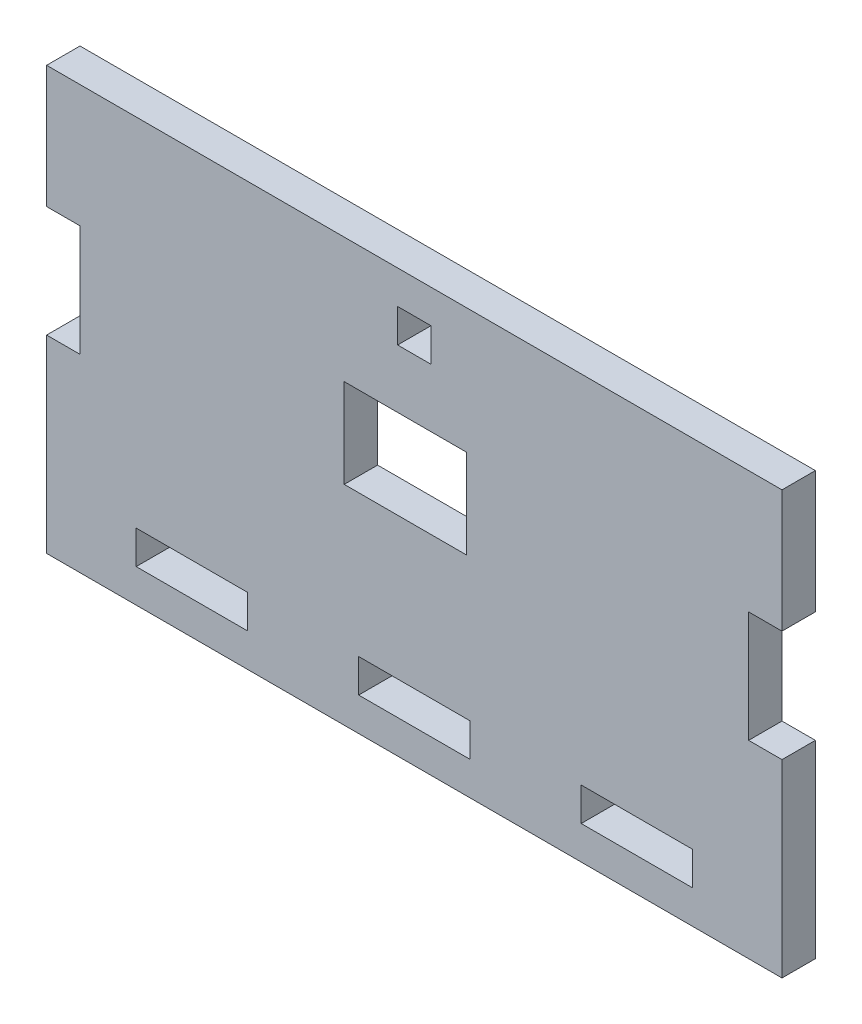
ISO-10303-21;
HEADER;
FILE_DESCRIPTION(('STEP AP214'),'2;1');
FILE_NAME('part.step','',(''),(''),'','','');
FILE_SCHEMA(('AUTOMOTIVE_DESIGN { 1 0 10303 214 1 1 1 1 }'));
ENDSEC;
DATA;
#1=APPLICATION_CONTEXT('core data for automotive mechanical design processes');
#2=APPLICATION_PROTOCOL_DEFINITION('international standard','automotive_design',2000,#1);
#3=PRODUCT_CONTEXT('',#1,'mechanical');
#4=PRODUCT('Part','Part','',(#3));
#5=PRODUCT_RELATED_PRODUCT_CATEGORY('part','',(#4));
#6=PRODUCT_DEFINITION_FORMATION('','',#4);
#7=PRODUCT_DEFINITION_CONTEXT('part definition',#1,'design');
#8=PRODUCT_DEFINITION('design','',#6,#7);
#9=PRODUCT_DEFINITION_SHAPE('','',#8);
#10=(LENGTH_UNIT() NAMED_UNIT(*) SI_UNIT(.MILLI.,.METRE.));
#11=(NAMED_UNIT(*) PLANE_ANGLE_UNIT() SI_UNIT($,.RADIAN.));
#12=(NAMED_UNIT(*) SI_UNIT($,.STERADIAN.) SOLID_ANGLE_UNIT());
#13=UNCERTAINTY_MEASURE_WITH_UNIT(LENGTH_MEASURE(1.E-05),#10,'distance_accuracy_value','');
#14=(GEOMETRIC_REPRESENTATION_CONTEXT(3) GLOBAL_UNCERTAINTY_ASSIGNED_CONTEXT((#13)) GLOBAL_UNIT_ASSIGNED_CONTEXT((#10,
#11,#12)) REPRESENTATION_CONTEXT('',''));
#15=CARTESIAN_POINT('',(0.,0.,0.));
#16=DIRECTION('',(0.,0.,1.));
#17=DIRECTION('',(1.,0.,0.));
#18=AXIS2_PLACEMENT_3D('',#15,#16,#17);
#19=CARTESIAN_POINT('',(-13.0561098857442,0.,3.));
#20=DIRECTION('',(1.,0.,0.));
#21=DIRECTION('',(0.,0.,-1.));
#22=AXIS2_PLACEMENT_3D('',#19,#20,#21);
#23=PLANE('',#22);
#24=DIRECTION('',(0.,-1.,0.));
#25=VECTOR('',#24,1.);
#26=CARTESIAN_POINT('',(-13.0561098857442,0.,0.));
#27=LINE('',#26,#25);
#28=CARTESIAN_POINT('',(-13.0561098857442,-7.19066330459412,0.));
#29=VERTEX_POINT('',#28);
#30=CARTESIAN_POINT('',(-13.0561098857442,-10.1906633045941,0.));
#31=VERTEX_POINT('',#30);
#32=EDGE_CURVE('E354',#29,#31,#27,.T.);
#33=ORIENTED_EDGE('',*,*,#32,.F.);
#34=DIRECTION('',(0.,0.,-1.));
#35=VECTOR('',#34,1.);
#36=CARTESIAN_POINT('',(-13.0561098857442,-7.19066330459412,3.));
#37=LINE('',#36,#35);
#38=CARTESIAN_POINT('',(-13.0561098857442,-7.19066330459412,3.));
#39=VERTEX_POINT('',#38);
#40=EDGE_CURVE('E11',#39,#29,#37,.T.);
#41=ORIENTED_EDGE('',*,*,#40,.F.);
#42=DIRECTION('',(0.,-1.,0.));
#43=VECTOR('',#42,1.);
#44=CARTESIAN_POINT('',(-13.0561098857442,0.,3.));
#45=LINE('',#44,#43);
#46=CARTESIAN_POINT('',(-13.0561098857442,-10.1906633045941,3.));
#47=VERTEX_POINT('',#46);
#48=EDGE_CURVE('E272',#39,#47,#45,.T.);
#49=ORIENTED_EDGE('',*,*,#48,.T.);
#50=DIRECTION('',(0.,0.,-1.));
#51=VECTOR('',#50,1.);
#52=CARTESIAN_POINT('',(-13.0561098857442,-10.1906633045941,3.));
#53=LINE('',#52,#51);
#54=EDGE_CURVE('E161',#47,#31,#53,.T.);
#55=ORIENTED_EDGE('',*,*,#54,.T.);
#56=EDGE_LOOP('',(#33,#41,#49,#55));
#57=FACE_BOUND('',#56,.T.);
#58=ADVANCED_FACE('F35',(#57),#23,.T.);
#59=CARTESIAN_POINT('',(0.,-7.19066330459412,3.));
#60=DIRECTION('',(0.,-1.,0.));
#61=DIRECTION('',(1.,0.,0.));
#62=AXIS2_PLACEMENT_3D('',#59,#60,#61);
#63=PLANE('',#62);
#64=DIRECTION('',(-1.,0.,0.));
#65=VECTOR('',#64,1.);
#66=CARTESIAN_POINT('',(0.,-7.19066330459412,0.));
#67=LINE('',#66,#65);
#68=CARTESIAN_POINT('',(-3.05610988574417,-7.19066330459412,0.));
#69=VERTEX_POINT('',#68);
#70=EDGE_CURVE('E262',#69,#29,#67,.T.);
#71=ORIENTED_EDGE('',*,*,#70,.F.);
#72=DIRECTION('',(0.,0.,-1.));
#73=VECTOR('',#72,1.);
#74=CARTESIAN_POINT('',(-3.05610988574417,-7.19066330459412,3.));
#75=LINE('',#74,#73);
#76=CARTESIAN_POINT('',(-3.05610988574417,-7.19066330459412,3.));
#77=VERTEX_POINT('',#76);
#78=EDGE_CURVE('E45',#77,#69,#75,.T.);
#79=ORIENTED_EDGE('',*,*,#78,.F.);
#80=DIRECTION('',(-1.,0.,0.));
#81=VECTOR('',#80,1.);
#82=CARTESIAN_POINT('',(0.,-7.19066330459412,3.));
#83=LINE('',#82,#81);
#84=EDGE_CURVE('E260',#77,#39,#83,.T.);
#85=ORIENTED_EDGE('',*,*,#84,.T.);
#86=ORIENTED_EDGE('',*,*,#40,.T.);
#87=EDGE_LOOP('',(#71,#79,#85,#86));
#88=FACE_BOUND('',#87,.T.);
#89=ADVANCED_FACE('F258',(#88),#63,.T.);
#90=CARTESIAN_POINT('',(-3.05610988574417,0.,3.));
#91=DIRECTION('',(1.,0.,0.));
#92=DIRECTION('',(0.,1.,0.));
#93=AXIS2_PLACEMENT_3D('',#90,#91,#92);
#94=PLANE('',#93);
#95=DIRECTION('',(0.,-1.,0.));
#96=VECTOR('',#95,1.);
#97=CARTESIAN_POINT('',(-3.05610988574417,0.,0.));
#98=LINE('',#97,#96);
#99=CARTESIAN_POINT('',(-3.05610988574417,-10.1906633045941,0.));
#100=VERTEX_POINT('',#99);
#101=EDGE_CURVE('E357',#69,#100,#98,.T.);
#102=ORIENTED_EDGE('',*,*,#101,.T.);
#103=DIRECTION('',(0.,0.,-1.));
#104=VECTOR('',#103,1.);
#105=CARTESIAN_POINT('',(-3.05610988574417,-10.1906633045941,3.));
#106=LINE('',#105,#104);
#107=CARTESIAN_POINT('',(-3.05610988574417,-10.1906633045941,3.));
#108=VERTEX_POINT('',#107);
#109=EDGE_CURVE('E265',#108,#100,#106,.T.);
#110=ORIENTED_EDGE('',*,*,#109,.F.);
#111=DIRECTION('',(0.,-1.,0.));
#112=VECTOR('',#111,1.);
#113=CARTESIAN_POINT('',(-3.05610988574417,0.,3.));
#114=LINE('',#113,#112);
#115=EDGE_CURVE('E268',#77,#108,#114,.T.);
#116=ORIENTED_EDGE('',*,*,#115,.F.);
#117=ORIENTED_EDGE('',*,*,#78,.T.);
#118=EDGE_LOOP('',(#102,#110,#116,#117));
#119=FACE_BOUND('',#118,.T.);
#120=ADVANCED_FACE('F269',(#119),#94,.F.);
#121=CARTESIAN_POINT('',(-53.0561098857442,-1.22716905817074E-13,3.));
#122=DIRECTION('',(1.,0.,0.));
#123=DIRECTION('',(0.,1.,0.));
#124=AXIS2_PLACEMENT_3D('',#121,#122,#123);
#125=PLANE('',#124);
#126=DIRECTION('',(0.,-1.,0.));
#127=VECTOR('',#126,1.);
#128=CARTESIAN_POINT('',(-53.0561098857442,-1.22716905817074E-13,0.));
#129=LINE('',#128,#127);
#130=CARTESIAN_POINT('',(-53.0561098857442,-7.1906633045941,0.));
#131=VERTEX_POINT('',#130);
#132=CARTESIAN_POINT('',(-53.0561098857442,-10.1906633045941,0.));
#133=VERTEX_POINT('',#132);
#134=EDGE_CURVE('E342',#131,#133,#129,.T.);
#135=ORIENTED_EDGE('',*,*,#134,.F.);
#136=DIRECTION('',(0.,0.,-1.));
#137=VECTOR('',#136,1.);
#138=CARTESIAN_POINT('',(-53.0561098857442,-7.1906633045941,3.));
#139=LINE('',#138,#137);
#140=CARTESIAN_POINT('',(-53.0561098857442,-7.1906633045941,3.));
#141=VERTEX_POINT('',#140);
#142=EDGE_CURVE('E362',#141,#131,#139,.T.);
#143=ORIENTED_EDGE('',*,*,#142,.F.);
#144=DIRECTION('',(0.,-1.,0.));
#145=VECTOR('',#144,1.);
#146=CARTESIAN_POINT('',(-53.0561098857442,-1.22716905817074E-13,3.));
#147=LINE('',#146,#145);
#148=CARTESIAN_POINT('',(-53.0561098857442,-10.1906633045941,3.));
#149=VERTEX_POINT('',#148);
#150=EDGE_CURVE('E815',#141,#149,#147,.T.);
#151=ORIENTED_EDGE('',*,*,#150,.T.);
#152=DIRECTION('',(0.,0.,-1.));
#153=VECTOR('',#152,1.);
#154=CARTESIAN_POINT('',(-53.0561098857442,-10.1906633045941,3.));
#155=LINE('',#154,#153);
#156=EDGE_CURVE('E364',#149,#133,#155,.T.);
#157=ORIENTED_EDGE('',*,*,#156,.T.);
#158=EDGE_LOOP('',(#135,#143,#151,#157));
#159=FACE_BOUND('',#158,.T.);
#160=ADVANCED_FACE('F468',(#159),#125,.T.);
#161=CARTESIAN_POINT('',(0.,-7.19066330459405,3.));
#162=DIRECTION('',(0.,1.,0.));
#163=DIRECTION('',(-1.,0.,0.));
#164=AXIS2_PLACEMENT_3D('',#161,#162,#163);
#165=PLANE('',#164);
#166=DIRECTION('',(1.,0.,0.));
#167=VECTOR('',#166,1.);
#168=CARTESIAN_POINT('',(0.,-7.19066330459405,0.));
#169=LINE('',#168,#167);
#170=CARTESIAN_POINT('',(-43.0561098857442,-7.19066330459409,0.));
#171=VERTEX_POINT('',#170);
#172=EDGE_CURVE('E345',#131,#171,#169,.T.);
#173=ORIENTED_EDGE('',*,*,#172,.T.);
#174=DIRECTION('',(0.,0.,-1.));
#175=VECTOR('',#174,1.);
#176=CARTESIAN_POINT('',(-43.0561098857442,-7.19066330459409,3.));
#177=LINE('',#176,#175);
#178=CARTESIAN_POINT('',(-43.0561098857442,-7.19066330459409,3.));
#179=VERTEX_POINT('',#178);
#180=EDGE_CURVE('E369',#179,#171,#177,.T.);
#181=ORIENTED_EDGE('',*,*,#180,.F.);
#182=DIRECTION('',(1.,0.,0.));
#183=VECTOR('',#182,1.);
#184=CARTESIAN_POINT('',(0.,-7.19066330459405,3.));
#185=LINE('',#184,#183);
#186=EDGE_CURVE('E818',#141,#179,#185,.T.);
#187=ORIENTED_EDGE('',*,*,#186,.F.);
#188=ORIENTED_EDGE('',*,*,#142,.T.);
#189=EDGE_LOOP('',(#173,#181,#187,#188));
#190=FACE_BOUND('',#189,.T.);
#191=ADVANCED_FACE('F464',(#190),#165,.F.);
#192=CARTESIAN_POINT('',(-43.0561098857442,0.,3.));
#193=DIRECTION('',(1.,0.,0.));
#194=DIRECTION('',(0.,0.,-1.));
#195=AXIS2_PLACEMENT_3D('',#192,#193,#194);
#196=PLANE('',#195);
#197=DIRECTION('',(0.,-1.,0.));
#198=VECTOR('',#197,1.);
#199=CARTESIAN_POINT('',(-43.0561098857442,0.,0.));
#200=LINE('',#199,#198);
#201=CARTESIAN_POINT('',(-43.0561098857442,-10.1906633045941,0.));
#202=VERTEX_POINT('',#201);
#203=EDGE_CURVE('E348',#171,#202,#200,.T.);
#204=ORIENTED_EDGE('',*,*,#203,.T.);
#205=DIRECTION('',(0.,0.,-1.));
#206=VECTOR('',#205,1.);
#207=CARTESIAN_POINT('',(-43.0561098857442,-10.1906633045941,3.));
#208=LINE('',#207,#206);
#209=CARTESIAN_POINT('',(-43.0561098857442,-10.1906633045941,3.));
#210=VERTEX_POINT('',#209);
#211=EDGE_CURVE('E366',#210,#202,#208,.T.);
#212=ORIENTED_EDGE('',*,*,#211,.F.);
#213=DIRECTION('',(0.,-1.,0.));
#214=VECTOR('',#213,1.);
#215=CARTESIAN_POINT('',(-43.0561098857442,0.,3.));
#216=LINE('',#215,#214);
#217=EDGE_CURVE('E821',#179,#210,#216,.T.);
#218=ORIENTED_EDGE('',*,*,#217,.F.);
#219=ORIENTED_EDGE('',*,*,#180,.T.);
#220=EDGE_LOOP('',(#204,#212,#218,#219));
#221=FACE_BOUND('',#220,.T.);
#222=ADVANCED_FACE('F460',(#221),#196,.F.);
#223=CARTESIAN_POINT('',(-23.3561098857442,0.,3.));
#224=DIRECTION('',(1.,0.,0.));
#225=DIRECTION('',(0.,1.,0.));
#226=AXIS2_PLACEMENT_3D('',#223,#224,#225);
#227=PLANE('',#226);
#228=DIRECTION('',(0.,-1.,0.));
#229=VECTOR('',#228,1.);
#230=CARTESIAN_POINT('',(-23.3561098857442,0.,0.));
#231=LINE('',#230,#229);
#232=CARTESIAN_POINT('',(-23.3561098857442,13.5593366954059,0.));
#233=VERTEX_POINT('',#232);
#234=CARTESIAN_POINT('',(-23.3561098857442,5.55933669540594,0.));
#235=VERTEX_POINT('',#234);
#236=EDGE_CURVE('E331',#233,#235,#231,.T.);
#237=ORIENTED_EDGE('',*,*,#236,.T.);
#238=DIRECTION('',(0.,0.,-1.));
#239=VECTOR('',#238,1.);
#240=CARTESIAN_POINT('',(-23.3561098857442,5.55933669540594,3.));
#241=LINE('',#240,#239);
#242=CARTESIAN_POINT('',(-23.3561098857442,5.55933669540594,3.));
#243=VERTEX_POINT('',#242);
#244=EDGE_CURVE('E367',#243,#235,#241,.T.);
#245=ORIENTED_EDGE('',*,*,#244,.F.);
#246=DIRECTION('',(0.,-1.,0.));
#247=VECTOR('',#246,1.);
#248=CARTESIAN_POINT('',(-23.3561098857442,0.,3.));
#249=LINE('',#248,#247);
#250=CARTESIAN_POINT('',(-23.3561098857442,13.5593366954059,3.));
#251=VERTEX_POINT('',#250);
#252=EDGE_CURVE('E805',#251,#243,#249,.T.);
#253=ORIENTED_EDGE('',*,*,#252,.F.);
#254=DIRECTION('',(0.,0.,-1.));
#255=VECTOR('',#254,1.);
#256=CARTESIAN_POINT('',(-23.3561098857442,13.5593366954059,3.));
#257=LINE('',#256,#255);
#258=EDGE_CURVE('E373',#251,#233,#257,.T.);
#259=ORIENTED_EDGE('',*,*,#258,.T.);
#260=EDGE_LOOP('',(#237,#245,#253,#259));
#261=FACE_BOUND('',#260,.T.);
#262=ADVANCED_FACE('F463',(#261),#227,.F.);
#263=CARTESIAN_POINT('',(0.,5.55933669540602,3.));
#264=DIRECTION('',(0.,1.,0.));
#265=DIRECTION('',(-1.,0.,0.));
#266=AXIS2_PLACEMENT_3D('',#263,#264,#265);
#267=PLANE('',#266);
#268=DIRECTION('',(1.,0.,0.));
#269=VECTOR('',#268,1.);
#270=CARTESIAN_POINT('',(0.,5.55933669540602,0.));
#271=LINE('',#270,#269);
#272=CARTESIAN_POINT('',(-34.3561098857442,5.55933669540591,0.));
#273=VERTEX_POINT('',#272);
#274=EDGE_CURVE('E334',#273,#235,#271,.T.);
#275=ORIENTED_EDGE('',*,*,#274,.F.);
#276=DIRECTION('',(0.,0.,-1.));
#277=VECTOR('',#276,1.);
#278=CARTESIAN_POINT('',(-34.3561098857442,5.55933669540591,3.));
#279=LINE('',#278,#277);
#280=CARTESIAN_POINT('',(-34.3561098857442,5.55933669540591,3.));
#281=VERTEX_POINT('',#280);
#282=EDGE_CURVE('E379',#281,#273,#279,.T.);
#283=ORIENTED_EDGE('',*,*,#282,.F.);
#284=DIRECTION('',(1.,0.,0.));
#285=VECTOR('',#284,1.);
#286=CARTESIAN_POINT('',(0.,5.55933669540602,3.));
#287=LINE('',#286,#285);
#288=EDGE_CURVE('E807',#281,#243,#287,.T.);
#289=ORIENTED_EDGE('',*,*,#288,.T.);
#290=ORIENTED_EDGE('',*,*,#244,.T.);
#291=EDGE_LOOP('',(#275,#283,#289,#290));
#292=FACE_BOUND('',#291,.T.);
#293=ADVANCED_FACE('F481',(#292),#267,.T.);
#294=CARTESIAN_POINT('',(-34.3561098857442,0.,3.));
#295=DIRECTION('',(1.,0.,0.));
#296=DIRECTION('',(0.,0.,-1.));
#297=AXIS2_PLACEMENT_3D('',#294,#295,#296);
#298=PLANE('',#297);
#299=DIRECTION('',(0.,-1.,0.));
#300=VECTOR('',#299,1.);
#301=CARTESIAN_POINT('',(-34.3561098857442,0.,0.));
#302=LINE('',#301,#300);
#303=CARTESIAN_POINT('',(-34.3561098857442,13.5593366954059,0.));
#304=VERTEX_POINT('',#303);
#305=EDGE_CURVE('E337',#304,#273,#302,.T.);
#306=ORIENTED_EDGE('',*,*,#305,.F.);
#307=DIRECTION('',(0.,0.,-1.));
#308=VECTOR('',#307,1.);
#309=CARTESIAN_POINT('',(-34.3561098857442,13.5593366954059,3.));
#310=LINE('',#309,#308);
#311=CARTESIAN_POINT('',(-34.3561098857442,13.5593366954059,3.));
#312=VERTEX_POINT('',#311);
#313=EDGE_CURVE('E376',#312,#304,#310,.T.);
#314=ORIENTED_EDGE('',*,*,#313,.F.);
#315=DIRECTION('',(0.,-1.,0.));
#316=VECTOR('',#315,1.);
#317=CARTESIAN_POINT('',(-34.3561098857442,0.,3.));
#318=LINE('',#317,#316);
#319=EDGE_CURVE('E810',#312,#281,#318,.T.);
#320=ORIENTED_EDGE('',*,*,#319,.T.);
#321=ORIENTED_EDGE('',*,*,#282,.T.);
#322=EDGE_LOOP('',(#306,#314,#320,#321));
#323=FACE_BOUND('',#322,.T.);
#324=ADVANCED_FACE('F477',(#323),#298,.T.);
#325=CARTESIAN_POINT('',(0.,-7.19066330459415,3.));
#326=DIRECTION('',(0.,-1.,0.));
#327=DIRECTION('',(1.,0.,0.));
#328=AXIS2_PLACEMENT_3D('',#325,#326,#327);
#329=PLANE('',#328);
#330=DIRECTION('',(-1.,0.,0.));
#331=VECTOR('',#330,1.);
#332=CARTESIAN_POINT('',(0.,-7.19066330459415,0.));
#333=LINE('',#332,#331);
#334=CARTESIAN_POINT('',(-23.0561098857442,-7.19066330459408,0.));
#335=VERTEX_POINT('',#334);
#336=CARTESIAN_POINT('',(-33.0561098857442,-7.19066330459406,0.));
#337=VERTEX_POINT('',#336);
#338=EDGE_CURVE('E319',#335,#337,#333,.T.);
#339=ORIENTED_EDGE('',*,*,#338,.F.);
#340=DIRECTION('',(0.,0.,-1.));
#341=VECTOR('',#340,1.);
#342=CARTESIAN_POINT('',(-23.0561098857442,-7.19066330459408,3.));
#343=LINE('',#342,#341);
#344=CARTESIAN_POINT('',(-23.0561098857442,-7.19066330459408,3.));
#345=VERTEX_POINT('',#344);
#346=EDGE_CURVE('E377',#345,#335,#343,.T.);
#347=ORIENTED_EDGE('',*,*,#346,.F.);
#348=DIRECTION('',(-1.,0.,0.));
#349=VECTOR('',#348,1.);
#350=CARTESIAN_POINT('',(0.,-7.19066330459415,3.));
#351=LINE('',#350,#349);
#352=CARTESIAN_POINT('',(-33.0561098857442,-7.19066330459406,3.));
#353=VERTEX_POINT('',#352);
#354=EDGE_CURVE('E789',#345,#353,#351,.T.);
#355=ORIENTED_EDGE('',*,*,#354,.T.);
#356=DIRECTION('',(0.,0.,-1.));
#357=VECTOR('',#356,1.);
#358=CARTESIAN_POINT('',(-33.0561098857442,-7.19066330459406,3.));
#359=LINE('',#358,#357);
#360=EDGE_CURVE('E382',#353,#337,#359,.T.);
#361=ORIENTED_EDGE('',*,*,#360,.T.);
#362=EDGE_LOOP('',(#339,#347,#355,#361));
#363=FACE_BOUND('',#362,.T.);
#364=ADVANCED_FACE('F480',(#363),#329,.T.);
#365=CARTESIAN_POINT('',(-23.0561098857442,0.,3.));
#366=DIRECTION('',(-1.,0.,0.));
#367=DIRECTION('',(0.,-1.,0.));
#368=AXIS2_PLACEMENT_3D('',#365,#366,#367);
#369=PLANE('',#368);
#370=DIRECTION('',(0.,1.,0.));
#371=VECTOR('',#370,1.);
#372=CARTESIAN_POINT('',(-23.0561098857442,0.,0.));
#373=LINE('',#372,#371);
#374=CARTESIAN_POINT('',(-23.0561098857442,-10.1906633045941,0.));
#375=VERTEX_POINT('',#374);
#376=EDGE_CURVE('E322',#375,#335,#373,.T.);
#377=ORIENTED_EDGE('',*,*,#376,.F.);
#378=DIRECTION('',(0.,0.,-1.));
#379=VECTOR('',#378,1.);
#380=CARTESIAN_POINT('',(-23.0561098857442,-10.1906633045941,3.));
#381=LINE('',#380,#379);
#382=CARTESIAN_POINT('',(-23.0561098857442,-10.1906633045941,3.));
#383=VERTEX_POINT('',#382);
#384=EDGE_CURVE('E387',#383,#375,#381,.T.);
#385=ORIENTED_EDGE('',*,*,#384,.F.);
#386=DIRECTION('',(0.,1.,0.));
#387=VECTOR('',#386,1.);
#388=CARTESIAN_POINT('',(-23.0561098857442,0.,3.));
#389=LINE('',#388,#387);
#390=EDGE_CURVE('E797',#383,#345,#389,.T.);
#391=ORIENTED_EDGE('',*,*,#390,.T.);
#392=ORIENTED_EDGE('',*,*,#346,.T.);
#393=EDGE_LOOP('',(#377,#385,#391,#392));
#394=FACE_BOUND('',#393,.T.);
#395=ADVANCED_FACE('F497',(#394),#369,.T.);
#396=CARTESIAN_POINT('',(0.,-10.1906633045942,3.));
#397=DIRECTION('',(0.,1.,0.));
#398=DIRECTION('',(-1.,0.,0.));
#399=AXIS2_PLACEMENT_3D('',#396,#397,#398);
#400=PLANE('',#399);
#401=DIRECTION('',(1.,0.,0.));
#402=VECTOR('',#401,1.);
#403=CARTESIAN_POINT('',(0.,-10.1906633045942,0.));
#404=LINE('',#403,#402);
#405=CARTESIAN_POINT('',(-33.0561098857442,-10.1906633045941,0.));
#406=VERTEX_POINT('',#405);
#407=EDGE_CURVE('E325',#406,#375,#404,.T.);
#408=ORIENTED_EDGE('',*,*,#407,.F.);
#409=DIRECTION('',(0.,0.,-1.));
#410=VECTOR('',#409,1.);
#411=CARTESIAN_POINT('',(-33.0561098857442,-10.1906633045941,3.));
#412=LINE('',#411,#410);
#413=CARTESIAN_POINT('',(-33.0561098857442,-10.1906633045941,3.));
#414=VERTEX_POINT('',#413);
#415=EDGE_CURVE('E384',#414,#406,#412,.T.);
#416=ORIENTED_EDGE('',*,*,#415,.F.);
#417=DIRECTION('',(1.,0.,0.));
#418=VECTOR('',#417,1.);
#419=CARTESIAN_POINT('',(0.,-10.1906633045942,3.));
#420=LINE('',#419,#418);
#421=EDGE_CURVE('E800',#414,#383,#420,.T.);
#422=ORIENTED_EDGE('',*,*,#421,.T.);
#423=ORIENTED_EDGE('',*,*,#384,.T.);
#424=EDGE_LOOP('',(#408,#416,#422,#423));
#425=FACE_BOUND('',#424,.T.);
#426=ADVANCED_FACE('F493',(#425),#400,.T.);
#427=CARTESIAN_POINT('',(0.,-13.1906633045941,3.));
#428=DIRECTION('',(0.,1.,0.));
#429=DIRECTION('',(0.,0.,1.));
#430=AXIS2_PLACEMENT_3D('',#427,#428,#429);
#431=PLANE('',#430);
#432=DIRECTION('',(1.,0.,0.));
#433=VECTOR('',#432,1.);
#434=CARTESIAN_POINT('',(0.,-13.1906633045941,0.));
#435=LINE('',#434,#433);
#436=CARTESIAN_POINT('',(-61.1061098857442,-13.1906633045941,0.));
#437=VERTEX_POINT('',#436);
#438=CARTESIAN_POINT('',(4.99389011425583,-13.1906633045941,0.));
#439=VERTEX_POINT('',#438);
#440=EDGE_CURVE('E291',#437,#439,#435,.T.);
#441=ORIENTED_EDGE('',*,*,#440,.T.);
#442=DIRECTION('',(0.,0.,-1.));
#443=VECTOR('',#442,1.);
#444=CARTESIAN_POINT('',(4.99389011425583,-13.1906633045941,3.));
#445=LINE('',#444,#443);
#446=CARTESIAN_POINT('',(4.99389011425583,-13.1906633045941,3.));
#447=VERTEX_POINT('',#446);
#448=EDGE_CURVE('E385',#447,#439,#445,.T.);
#449=ORIENTED_EDGE('',*,*,#448,.F.);
#450=DIRECTION('',(1.,0.,0.));
#451=VECTOR('',#450,1.);
#452=CARTESIAN_POINT('',(0.,-13.1906633045941,3.));
#453=LINE('',#452,#451);
#454=CARTESIAN_POINT('',(-61.1061098857442,-13.1906633045941,3.));
#455=VERTEX_POINT('',#454);
#456=EDGE_CURVE('E872',#455,#447,#453,.T.);
#457=ORIENTED_EDGE('',*,*,#456,.F.);
#458=DIRECTION('',(0.,0.,-1.));
#459=VECTOR('',#458,1.);
#460=CARTESIAN_POINT('',(-61.1061098857442,-13.1906633045941,3.));
#461=LINE('',#460,#459);
#462=EDGE_CURVE('E390',#455,#437,#461,.T.);
#463=ORIENTED_EDGE('',*,*,#462,.T.);
#464=EDGE_LOOP('',(#441,#449,#457,#463));
#465=FACE_BOUND('',#464,.T.);
#466=ADVANCED_FACE('F496',(#465),#431,.F.);
#467=CARTESIAN_POINT('',(4.99389011425583,0.,3.));
#468=DIRECTION('',(1.,0.,0.));
#469=DIRECTION('',(0.,1.,0.));
#470=AXIS2_PLACEMENT_3D('',#467,#468,#469);
#471=PLANE('',#470);
#472=DIRECTION('',(0.,-1.,0.));
#473=VECTOR('',#472,1.);
#474=CARTESIAN_POINT('',(4.99389011425583,0.,0.));
#475=LINE('',#474,#473);
#476=CARTESIAN_POINT('',(4.99389011425583,3.8093366954059,0.));
#477=VERTEX_POINT('',#476);
#478=EDGE_CURVE('E294',#477,#439,#475,.T.);
#479=ORIENTED_EDGE('',*,*,#478,.F.);
#480=DIRECTION('',(0.,0.,-1.));
#481=VECTOR('',#480,1.);
#482=CARTESIAN_POINT('',(4.99389011425583,3.8093366954059,3.));
#483=LINE('',#482,#481);
#484=CARTESIAN_POINT('',(4.99389011425583,3.8093366954059,3.));
#485=VERTEX_POINT('',#484);
#486=EDGE_CURVE('E415',#485,#477,#483,.T.);
#487=ORIENTED_EDGE('',*,*,#486,.F.);
#488=DIRECTION('',(0.,-1.,0.));
#489=VECTOR('',#488,1.);
#490=CARTESIAN_POINT('',(4.99389011425583,0.,3.));
#491=LINE('',#490,#489);
#492=EDGE_CURVE('E869',#485,#447,#491,.T.);
#493=ORIENTED_EDGE('',*,*,#492,.T.);
#494=ORIENTED_EDGE('',*,*,#448,.T.);
#495=EDGE_LOOP('',(#479,#487,#493,#494));
#496=FACE_BOUND('',#495,.T.);
#497=ADVANCED_FACE('F530',(#496),#471,.T.);
#498=CARTESIAN_POINT('',(0.,3.8093366954059,3.));
#499=DIRECTION('',(0.,1.,0.));
#500=DIRECTION('',(0.,0.,1.));
#501=AXIS2_PLACEMENT_3D('',#498,#499,#500);
#502=PLANE('',#501);
#503=DIRECTION('',(1.,0.,0.));
#504=VECTOR('',#503,1.);
#505=CARTESIAN_POINT('',(0.,3.8093366954059,0.));
#506=LINE('',#505,#504);
#507=CARTESIAN_POINT('',(1.99389011425582,3.8093366954059,0.));
#508=VERTEX_POINT('',#507);
#509=EDGE_CURVE('E297',#508,#477,#506,.T.);
#510=ORIENTED_EDGE('',*,*,#509,.F.);
#511=DIRECTION('',(0.,0.,-1.));
#512=VECTOR('',#511,1.);
#513=CARTESIAN_POINT('',(1.99389011425582,3.8093366954059,3.));
#514=LINE('',#513,#512);
#515=CARTESIAN_POINT('',(1.99389011425582,3.8093366954059,3.));
#516=VERTEX_POINT('',#515);
#517=EDGE_CURVE('E413',#516,#508,#514,.T.);
#518=ORIENTED_EDGE('',*,*,#517,.F.);
#519=DIRECTION('',(1.,0.,0.));
#520=VECTOR('',#519,1.);
#521=CARTESIAN_POINT('',(0.,3.8093366954059,3.));
#522=LINE('',#521,#520);
#523=EDGE_CURVE('E866',#516,#485,#522,.T.);
#524=ORIENTED_EDGE('',*,*,#523,.T.);
#525=ORIENTED_EDGE('',*,*,#486,.T.);
#526=EDGE_LOOP('',(#510,#518,#524,#525));
#527=FACE_BOUND('',#526,.T.);
#528=ADVANCED_FACE('F537',(#527),#502,.T.);
#529=CARTESIAN_POINT('',(1.99389011425582,0.,3.));
#530=DIRECTION('',(1.,0.,0.));
#531=DIRECTION('',(0.,1.,0.));
#532=AXIS2_PLACEMENT_3D('',#529,#530,#531);
#533=PLANE('',#532);
#534=DIRECTION('',(0.,-1.,0.));
#535=VECTOR('',#534,1.);
#536=CARTESIAN_POINT('',(1.99389011425582,0.,0.));
#537=LINE('',#536,#535);
#538=CARTESIAN_POINT('',(1.99389011425582,13.8093366954059,0.));
#539=VERTEX_POINT('',#538);
#540=EDGE_CURVE('E301',#539,#508,#537,.T.);
#541=ORIENTED_EDGE('',*,*,#540,.F.);
#542=DIRECTION('',(0.,0.,-1.));
#543=VECTOR('',#542,1.);
#544=CARTESIAN_POINT('',(1.99389011425582,13.8093366954059,3.));
#545=LINE('',#544,#543);
#546=CARTESIAN_POINT('',(1.99389011425582,13.8093366954059,3.));
#547=VERTEX_POINT('',#546);
#548=EDGE_CURVE('E411',#547,#539,#545,.T.);
#549=ORIENTED_EDGE('',*,*,#548,.F.);
#550=DIRECTION('',(0.,-1.,0.));
#551=VECTOR('',#550,1.);
#552=CARTESIAN_POINT('',(1.99389011425582,0.,3.));
#553=LINE('',#552,#551);
#554=EDGE_CURVE('E863',#547,#516,#553,.T.);
#555=ORIENTED_EDGE('',*,*,#554,.T.);
#556=ORIENTED_EDGE('',*,*,#517,.T.);
#557=EDGE_LOOP('',(#541,#549,#555,#556));
#558=FACE_BOUND('',#557,.T.);
#559=ADVANCED_FACE('F533',(#558),#533,.T.);
#560=CARTESIAN_POINT('',(0.,13.8093366954059,3.));
#561=DIRECTION('',(0.,-1.,0.));
#562=DIRECTION('',(0.,0.,-1.));
#563=AXIS2_PLACEMENT_3D('',#560,#561,#562);
#564=PLANE('',#563);
#565=DIRECTION('',(-1.,0.,0.));
#566=VECTOR('',#565,1.);
#567=CARTESIAN_POINT('',(0.,13.8093366954059,0.));
#568=LINE('',#567,#566);
#569=CARTESIAN_POINT('',(4.99389011425582,13.8093366954059,0.));
#570=VERTEX_POINT('',#569);
#571=EDGE_CURVE('E304',#570,#539,#568,.T.);
#572=ORIENTED_EDGE('',*,*,#571,.F.);
#573=DIRECTION('',(0.,0.,-1.));
#574=VECTOR('',#573,1.);
#575=CARTESIAN_POINT('',(4.99389011425582,13.8093366954059,3.));
#576=LINE('',#575,#574);
#577=CARTESIAN_POINT('',(4.99389011425582,13.8093366954059,3.));
#578=VERTEX_POINT('',#577);
#579=EDGE_CURVE('E409',#578,#570,#576,.T.);
#580=ORIENTED_EDGE('',*,*,#579,.F.);
#581=DIRECTION('',(-1.,0.,0.));
#582=VECTOR('',#581,1.);
#583=CARTESIAN_POINT('',(0.,13.8093366954059,3.));
#584=LINE('',#583,#582);
#585=EDGE_CURVE('E860',#578,#547,#584,.T.);
#586=ORIENTED_EDGE('',*,*,#585,.T.);
#587=ORIENTED_EDGE('',*,*,#548,.T.);
#588=EDGE_LOOP('',(#572,#580,#586,#587));
#589=FACE_BOUND('',#588,.T.);
#590=ADVANCED_FACE('F528',(#589),#564,.T.);
#591=CARTESIAN_POINT('',(4.99389011425582,24.8093366954059,0.));
#592=VERTEX_POINT('',#591);
#593=EDGE_CURVE('E298',#592,#570,#475,.T.);
#594=ORIENTED_EDGE('',*,*,#593,.F.);
#595=DIRECTION('',(0.,0.,-1.));
#596=VECTOR('',#595,1.);
#597=CARTESIAN_POINT('',(4.99389011425582,24.8093366954059,3.));
#598=LINE('',#597,#596);
#599=CARTESIAN_POINT('',(4.99389011425582,24.8093366954059,3.));
#600=VERTEX_POINT('',#599);
#601=EDGE_CURVE('E407',#600,#592,#598,.T.);
#602=ORIENTED_EDGE('',*,*,#601,.F.);
#603=EDGE_CURVE('E859',#600,#578,#491,.T.);
#604=ORIENTED_EDGE('',*,*,#603,.T.);
#605=ORIENTED_EDGE('',*,*,#579,.T.);
#606=EDGE_LOOP('',(#594,#602,#604,#605));
#607=FACE_BOUND('',#606,.T.);
#608=ADVANCED_FACE('F524',(#607),#471,.T.);
#609=CARTESIAN_POINT('',(0.,24.8093366954059,3.));
#610=DIRECTION('',(0.,1.,0.));
#611=DIRECTION('',(-1.,0.,0.));
#612=AXIS2_PLACEMENT_3D('',#609,#610,#611);
#613=PLANE('',#612);
#614=DIRECTION('',(1.,0.,0.));
#615=VECTOR('',#614,1.);
#616=CARTESIAN_POINT('',(0.,24.8093366954059,0.));
#617=LINE('',#616,#615);
#618=CARTESIAN_POINT('',(-61.1061098857442,24.8093366954059,0.));
#619=VERTEX_POINT('',#618);
#620=EDGE_CURVE('E307',#619,#592,#617,.T.);
#621=ORIENTED_EDGE('',*,*,#620,.F.);
#622=DIRECTION('',(0.,0.,-1.));
#623=VECTOR('',#622,1.);
#624=CARTESIAN_POINT('',(-61.1061098857442,24.8093366954059,3.));
#625=LINE('',#624,#623);
#626=CARTESIAN_POINT('',(-61.1061098857442,24.8093366954059,3.));
#627=VERTEX_POINT('',#626);
#628=EDGE_CURVE('E405',#627,#619,#625,.T.);
#629=ORIENTED_EDGE('',*,*,#628,.F.);
#630=DIRECTION('',(1.,0.,0.));
#631=VECTOR('',#630,1.);
#632=CARTESIAN_POINT('',(0.,24.8093366954059,3.));
#633=LINE('',#632,#631);
#634=EDGE_CURVE('E856',#627,#600,#633,.T.);
#635=ORIENTED_EDGE('',*,*,#634,.T.);
#636=ORIENTED_EDGE('',*,*,#601,.T.);
#637=EDGE_LOOP('',(#621,#629,#635,#636));
#638=FACE_BOUND('',#637,.T.);
#639=ADVANCED_FACE('F521',(#638),#613,.T.);
#640=CARTESIAN_POINT('',(-61.1061098857442,0.,3.));
#641=DIRECTION('',(1.,0.,0.));
#642=DIRECTION('',(0.,1.,0.));
#643=AXIS2_PLACEMENT_3D('',#640,#641,#642);
#644=PLANE('',#643);
#645=DIRECTION('',(0.,-1.,0.));
#646=VECTOR('',#645,1.);
#647=CARTESIAN_POINT('',(-61.1061098857442,0.,0.));
#648=LINE('',#647,#646);
#649=CARTESIAN_POINT('',(-61.1061098857442,13.8093366954059,0.));
#650=VERTEX_POINT('',#649);
#651=EDGE_CURVE('E310',#619,#650,#648,.T.);
#652=ORIENTED_EDGE('',*,*,#651,.T.);
#653=DIRECTION('',(0.,0.,-1.));
#654=VECTOR('',#653,1.);
#655=CARTESIAN_POINT('',(-61.1061098857442,13.8093366954059,3.));
#656=LINE('',#655,#654);
#657=CARTESIAN_POINT('',(-61.1061098857442,13.8093366954059,3.));
#658=VERTEX_POINT('',#657);
#659=EDGE_CURVE('E402',#658,#650,#656,.T.);
#660=ORIENTED_EDGE('',*,*,#659,.F.);
#661=DIRECTION('',(0.,-1.,0.));
#662=VECTOR('',#661,1.);
#663=CARTESIAN_POINT('',(-61.1061098857442,0.,3.));
#664=LINE('',#663,#662);
#665=EDGE_CURVE('E791',#627,#658,#664,.T.);
#666=ORIENTED_EDGE('',*,*,#665,.F.);
#667=ORIENTED_EDGE('',*,*,#628,.T.);
#668=EDGE_LOOP('',(#652,#660,#666,#667));
#669=FACE_BOUND('',#668,.T.);
#670=ADVANCED_FACE('F508',(#669),#644,.F.);
#671=CARTESIAN_POINT('',(0.,13.8093366954059,3.));
#672=DIRECTION('',(0.,1.,0.));
#673=DIRECTION('',(0.,0.,1.));
#674=AXIS2_PLACEMENT_3D('',#671,#672,#673);
#675=PLANE('',#674);
#676=DIRECTION('',(1.,0.,0.));
#677=VECTOR('',#676,1.);
#678=CARTESIAN_POINT('',(0.,13.8093366954059,0.));
#679=LINE('',#678,#677);
#680=CARTESIAN_POINT('',(-58.1061098857442,13.8093366954059,0.));
#681=VERTEX_POINT('',#680);
#682=EDGE_CURVE('E312',#650,#681,#679,.T.);
#683=ORIENTED_EDGE('',*,*,#682,.T.);
#684=DIRECTION('',(0.,0.,-1.));
#685=VECTOR('',#684,1.);
#686=CARTESIAN_POINT('',(-58.1061098857442,13.8093366954059,3.));
#687=LINE('',#686,#685);
#688=CARTESIAN_POINT('',(-58.1061098857442,13.8093366954059,3.));
#689=VERTEX_POINT('',#688);
#690=EDGE_CURVE('E399',#689,#681,#687,.T.);
#691=ORIENTED_EDGE('',*,*,#690,.F.);
#692=DIRECTION('',(1.,0.,0.));
#693=VECTOR('',#692,1.);
#694=CARTESIAN_POINT('',(0.,13.8093366954059,3.));
#695=LINE('',#694,#693);
#696=EDGE_CURVE('E773',#658,#689,#695,.T.);
#697=ORIENTED_EDGE('',*,*,#696,.F.);
#698=ORIENTED_EDGE('',*,*,#659,.T.);
#699=EDGE_LOOP('',(#683,#691,#697,#698));
#700=FACE_BOUND('',#699,.T.);
#701=ADVANCED_FACE('F516',(#700),#675,.F.);
#702=CARTESIAN_POINT('',(-58.1061098857442,0.,3.));
#703=DIRECTION('',(1.,0.,0.));
#704=DIRECTION('',(0.,0.,-1.));
#705=AXIS2_PLACEMENT_3D('',#702,#703,#704);
#706=PLANE('',#705);
#707=DIRECTION('',(0.,-1.,0.));
#708=VECTOR('',#707,1.);
#709=CARTESIAN_POINT('',(-58.1061098857442,0.,0.));
#710=LINE('',#709,#708);
#711=CARTESIAN_POINT('',(-58.1061098857442,3.8093366954059,0.));
#712=VERTEX_POINT('',#711);
#713=EDGE_CURVE('E315',#681,#712,#710,.T.);
#714=ORIENTED_EDGE('',*,*,#713,.T.);
#715=DIRECTION('',(0.,0.,-1.));
#716=VECTOR('',#715,1.);
#717=CARTESIAN_POINT('',(-58.1061098857442,3.8093366954059,3.));
#718=LINE('',#717,#716);
#719=CARTESIAN_POINT('',(-58.1061098857442,3.8093366954059,3.));
#720=VERTEX_POINT('',#719);
#721=EDGE_CURVE('E396',#720,#712,#718,.T.);
#722=ORIENTED_EDGE('',*,*,#721,.F.);
#723=DIRECTION('',(0.,-1.,0.));
#724=VECTOR('',#723,1.);
#725=CARTESIAN_POINT('',(-58.1061098857442,0.,3.));
#726=LINE('',#725,#724);
#727=EDGE_CURVE('E787',#689,#720,#726,.T.);
#728=ORIENTED_EDGE('',*,*,#727,.F.);
#729=ORIENTED_EDGE('',*,*,#690,.T.);
#730=EDGE_LOOP('',(#714,#722,#728,#729));
#731=FACE_BOUND('',#730,.T.);
#732=ADVANCED_FACE('F512',(#731),#706,.F.);
#733=CARTESIAN_POINT('',(0.,3.8093366954059,3.));
#734=DIRECTION('',(0.,-1.,0.));
#735=DIRECTION('',(0.,0.,-1.));
#736=AXIS2_PLACEMENT_3D('',#733,#734,#735);
#737=PLANE('',#736);
#738=DIRECTION('',(-1.,0.,0.));
#739=VECTOR('',#738,1.);
#740=CARTESIAN_POINT('',(0.,3.8093366954059,0.));
#741=LINE('',#740,#739);
#742=CARTESIAN_POINT('',(-61.1061098857442,3.8093366954059,0.));
#743=VERTEX_POINT('',#742);
#744=EDGE_CURVE('E317',#712,#743,#741,.T.);
#745=ORIENTED_EDGE('',*,*,#744,.T.);
#746=DIRECTION('',(0.,0.,-1.));
#747=VECTOR('',#746,1.);
#748=CARTESIAN_POINT('',(-61.1061098857442,3.8093366954059,3.));
#749=LINE('',#748,#747);
#750=CARTESIAN_POINT('',(-61.1061098857442,3.8093366954059,3.));
#751=VERTEX_POINT('',#750);
#752=EDGE_CURVE('E393',#751,#743,#749,.T.);
#753=ORIENTED_EDGE('',*,*,#752,.F.);
#754=DIRECTION('',(-1.,0.,0.));
#755=VECTOR('',#754,1.);
#756=CARTESIAN_POINT('',(0.,3.8093366954059,3.));
#757=LINE('',#756,#755);
#758=EDGE_CURVE('E783',#720,#751,#757,.T.);
#759=ORIENTED_EDGE('',*,*,#758,.F.);
#760=ORIENTED_EDGE('',*,*,#721,.T.);
#761=EDGE_LOOP('',(#745,#753,#759,#760));
#762=FACE_BOUND('',#761,.T.);
#763=ADVANCED_FACE('F509',(#762),#737,.F.);
#764=CARTESIAN_POINT('',(0.,21.8093366954059,3.));
#765=DIRECTION('',(0.,1.,0.));
#766=DIRECTION('',(0.,0.,1.));
#767=AXIS2_PLACEMENT_3D('',#764,#765,#766);
#768=PLANE('',#767);
#769=DIRECTION('',(1.,0.,0.));
#770=VECTOR('',#769,1.);
#771=CARTESIAN_POINT('',(0.,21.8093366954059,0.));
#772=LINE('',#771,#770);
#773=CARTESIAN_POINT('',(-29.5561098857442,21.8093366954059,0.));
#774=VERTEX_POINT('',#773);
#775=CARTESIAN_POINT('',(-26.5561098857442,21.8093366954059,0.));
#776=VERTEX_POINT('',#775);
#777=EDGE_CURVE('E280',#774,#776,#772,.T.);
#778=ORIENTED_EDGE('',*,*,#777,.T.);
#779=DIRECTION('',(0.,0.,-1.));
#780=VECTOR('',#779,1.);
#781=CARTESIAN_POINT('',(-26.5561098857442,21.8093366954059,3.));
#782=LINE('',#781,#780);
#783=CARTESIAN_POINT('',(-26.5561098857442,21.8093366954059,3.));
#784=VERTEX_POINT('',#783);
#785=EDGE_CURVE('E39',#784,#776,#782,.T.);
#786=ORIENTED_EDGE('',*,*,#785,.F.);
#787=DIRECTION('',(1.,0.,0.));
#788=VECTOR('',#787,1.);
#789=CARTESIAN_POINT('',(0.,21.8093366954059,3.));
#790=LINE('',#789,#788);
#791=CARTESIAN_POINT('',(-29.5561098857442,21.8093366954059,3.));
#792=VERTEX_POINT('',#791);
#793=EDGE_CURVE('E360',#792,#784,#790,.T.);
#794=ORIENTED_EDGE('',*,*,#793,.F.);
#795=DIRECTION('',(0.,0.,-1.));
#796=VECTOR('',#795,1.);
#797=CARTESIAN_POINT('',(-29.5561098857442,21.8093366954059,3.));
#798=LINE('',#797,#796);
#799=EDGE_CURVE('E279',#792,#774,#798,.T.);
#800=ORIENTED_EDGE('',*,*,#799,.T.);
#801=EDGE_LOOP('',(#778,#786,#794,#800));
#802=FACE_BOUND('',#801,.T.);
#803=ADVANCED_FACE('F37',(#802),#768,.F.);
#804=CARTESIAN_POINT('',(-26.5561098857442,0.,3.));
#805=DIRECTION('',(1.,0.,0.));
#806=DIRECTION('',(0.,0.,-1.));
#807=AXIS2_PLACEMENT_3D('',#804,#805,#806);
#808=PLANE('',#807);
#809=DIRECTION('',(0.,-1.,0.));
#810=VECTOR('',#809,1.);
#811=CARTESIAN_POINT('',(-26.5561098857442,0.,0.));
#812=LINE('',#811,#810);
#813=CARTESIAN_POINT('',(-26.5561098857442,18.8093366954059,0.));
#814=VERTEX_POINT('',#813);
#815=EDGE_CURVE('E283',#776,#814,#812,.T.);
#816=ORIENTED_EDGE('',*,*,#815,.T.);
#817=DIRECTION('',(0.,0.,-1.));
#818=VECTOR('',#817,1.);
#819=CARTESIAN_POINT('',(-26.5561098857442,18.8093366954059,3.));
#820=LINE('',#819,#818);
#821=CARTESIAN_POINT('',(-26.5561098857442,18.8093366954059,3.));
#822=VERTEX_POINT('',#821);
#823=EDGE_CURVE('E420',#822,#814,#820,.T.);
#824=ORIENTED_EDGE('',*,*,#823,.F.);
#825=DIRECTION('',(0.,-1.,0.));
#826=VECTOR('',#825,1.);
#827=CARTESIAN_POINT('',(-26.5561098857442,0.,3.));
#828=LINE('',#827,#826);
#829=EDGE_CURVE('E169',#784,#822,#828,.T.);
#830=ORIENTED_EDGE('',*,*,#829,.F.);
#831=ORIENTED_EDGE('',*,*,#785,.T.);
#832=EDGE_LOOP('',(#816,#824,#830,#831));
#833=FACE_BOUND('',#832,.T.);
#834=ADVANCED_FACE('F426',(#833),#808,.F.);
#835=CARTESIAN_POINT('',(0.,18.8093366954059,3.));
#836=DIRECTION('',(0.,-1.,0.));
#837=DIRECTION('',(1.,0.,0.));
#838=AXIS2_PLACEMENT_3D('',#835,#836,#837);
#839=PLANE('',#838);
#840=DIRECTION('',(-1.,0.,0.));
#841=VECTOR('',#840,1.);
#842=CARTESIAN_POINT('',(0.,18.8093366954059,0.));
#843=LINE('',#842,#841);
#844=CARTESIAN_POINT('',(-29.5561098857442,18.8093366954059,0.));
#845=VERTEX_POINT('',#844);
#846=EDGE_CURVE('E285',#814,#845,#843,.T.);
#847=ORIENTED_EDGE('',*,*,#846,.T.);
#848=DIRECTION('',(0.,0.,-1.));
#849=VECTOR('',#848,1.);
#850=CARTESIAN_POINT('',(-29.5561098857442,18.8093366954059,3.));
#851=LINE('',#850,#849);
#852=CARTESIAN_POINT('',(-29.5561098857442,18.8093366954059,3.));
#853=VERTEX_POINT('',#852);
#854=EDGE_CURVE('E419',#853,#845,#851,.T.);
#855=ORIENTED_EDGE('',*,*,#854,.F.);
#856=DIRECTION('',(-1.,0.,0.));
#857=VECTOR('',#856,1.);
#858=CARTESIAN_POINT('',(0.,18.8093366954059,3.));
#859=LINE('',#858,#857);
#860=EDGE_CURVE('E875',#822,#853,#859,.T.);
#861=ORIENTED_EDGE('',*,*,#860,.F.);
#862=ORIENTED_EDGE('',*,*,#823,.T.);
#863=EDGE_LOOP('',(#847,#855,#861,#862));
#864=FACE_BOUND('',#863,.T.);
#865=ADVANCED_FACE('F440',(#864),#839,.F.);
#866=CARTESIAN_POINT('',(0.,-10.1906633045941,3.));
#867=DIRECTION('',(0.,1.,0.));
#868=DIRECTION('',(-1.,0.,0.));
#869=AXIS2_PLACEMENT_3D('',#866,#867,#868);
#870=PLANE('',#869);
#871=DIRECTION('',(1.,0.,0.));
#872=VECTOR('',#871,1.);
#873=CARTESIAN_POINT('',(0.,-10.1906633045941,0.));
#874=LINE('',#873,#872);
#875=EDGE_CURVE('E351',#133,#202,#874,.T.);
#876=ORIENTED_EDGE('',*,*,#875,.F.);
#877=ORIENTED_EDGE('',*,*,#156,.F.);
#878=DIRECTION('',(1.,0.,0.));
#879=VECTOR('',#878,1.);
#880=CARTESIAN_POINT('',(0.,-10.1906633045941,3.));
#881=LINE('',#880,#879);
#882=EDGE_CURVE('E274',#149,#210,#881,.T.);
#883=ORIENTED_EDGE('',*,*,#882,.T.);
#884=ORIENTED_EDGE('',*,*,#211,.T.);
#885=EDGE_LOOP('',(#876,#877,#883,#884));
#886=FACE_BOUND('',#885,.T.);
#887=ADVANCED_FACE('F442',(#886),#870,.T.);
#888=CARTESIAN_POINT('',(0.,13.5593366954059,3.));
#889=DIRECTION('',(0.,1.,0.));
#890=DIRECTION('',(-1.,0.,0.));
#891=AXIS2_PLACEMENT_3D('',#888,#889,#890);
#892=PLANE('',#891);
#893=DIRECTION('',(1.,0.,0.));
#894=VECTOR('',#893,1.);
#895=CARTESIAN_POINT('',(0.,13.5593366954059,0.));
#896=LINE('',#895,#894);
#897=EDGE_CURVE('E340',#304,#233,#896,.T.);
#898=ORIENTED_EDGE('',*,*,#897,.T.);
#899=ORIENTED_EDGE('',*,*,#258,.F.);
#900=DIRECTION('',(1.,0.,0.));
#901=VECTOR('',#900,1.);
#902=CARTESIAN_POINT('',(0.,13.5593366954059,3.));
#903=LINE('',#902,#901);
#904=EDGE_CURVE('E813',#312,#251,#903,.T.);
#905=ORIENTED_EDGE('',*,*,#904,.F.);
#906=ORIENTED_EDGE('',*,*,#313,.T.);
#907=EDGE_LOOP('',(#898,#899,#905,#906));
#908=FACE_BOUND('',#907,.T.);
#909=ADVANCED_FACE('F448',(#908),#892,.F.);
#910=CARTESIAN_POINT('',(-33.0561098857442,0.,3.));
#911=DIRECTION('',(-1.,0.,0.));
#912=DIRECTION('',(0.,-1.,0.));
#913=AXIS2_PLACEMENT_3D('',#910,#911,#912);
#914=PLANE('',#913);
#915=DIRECTION('',(0.,1.,0.));
#916=VECTOR('',#915,1.);
#917=CARTESIAN_POINT('',(-33.0561098857442,0.,0.));
#918=LINE('',#917,#916);
#919=EDGE_CURVE('E328',#406,#337,#918,.T.);
#920=ORIENTED_EDGE('',*,*,#919,.T.);
#921=ORIENTED_EDGE('',*,*,#360,.F.);
#922=DIRECTION('',(0.,1.,0.));
#923=VECTOR('',#922,1.);
#924=CARTESIAN_POINT('',(-33.0561098857442,0.,3.));
#925=LINE('',#924,#923);
#926=EDGE_CURVE('E803',#414,#353,#925,.T.);
#927=ORIENTED_EDGE('',*,*,#926,.F.);
#928=ORIENTED_EDGE('',*,*,#415,.T.);
#929=EDGE_LOOP('',(#920,#921,#927,#928));
#930=FACE_BOUND('',#929,.T.);
#931=ADVANCED_FACE('F475',(#930),#914,.F.);
#932=EDGE_CURVE('E313',#743,#437,#648,.T.);
#933=ORIENTED_EDGE('',*,*,#932,.T.);
#934=ORIENTED_EDGE('',*,*,#462,.F.);
#935=EDGE_CURVE('E786',#751,#455,#664,.T.);
#936=ORIENTED_EDGE('',*,*,#935,.F.);
#937=ORIENTED_EDGE('',*,*,#752,.T.);
#938=EDGE_LOOP('',(#933,#934,#936,#937));
#939=FACE_BOUND('',#938,.T.);
#940=ADVANCED_FACE('F491',(#939),#644,.F.);
#941=CARTESIAN_POINT('',(-29.5561098857442,0.,3.));
#942=DIRECTION('',(1.,0.,0.));
#943=DIRECTION('',(0.,0.,-1.));
#944=AXIS2_PLACEMENT_3D('',#941,#942,#943);
#945=PLANE('',#944);
#946=DIRECTION('',(0.,-1.,0.));
#947=VECTOR('',#946,1.);
#948=CARTESIAN_POINT('',(-29.5561098857442,0.,0.));
#949=LINE('',#948,#947);
#950=EDGE_CURVE('E288',#774,#845,#949,.T.);
#951=ORIENTED_EDGE('',*,*,#950,.F.);
#952=ORIENTED_EDGE('',*,*,#799,.F.);
#953=DIRECTION('',(0.,-1.,0.));
#954=VECTOR('',#953,1.);
#955=CARTESIAN_POINT('',(-29.5561098857442,0.,3.));
#956=LINE('',#955,#954);
#957=EDGE_CURVE('E439',#792,#853,#956,.T.);
#958=ORIENTED_EDGE('',*,*,#957,.T.);
#959=ORIENTED_EDGE('',*,*,#854,.T.);
#960=EDGE_LOOP('',(#951,#952,#958,#959));
#961=FACE_BOUND('',#960,.T.);
#962=ADVANCED_FACE('F435',(#961),#945,.T.);
#963=CARTESIAN_POINT('',(0.,-10.1906633045941,3.));
#964=DIRECTION('',(0.,-1.,0.));
#965=DIRECTION('',(1.,0.,0.));
#966=AXIS2_PLACEMENT_3D('',#963,#964,#965);
#967=PLANE('',#966);
#968=DIRECTION('',(-1.,0.,0.));
#969=VECTOR('',#968,1.);
#970=CARTESIAN_POINT('',(0.,-10.1906633045941,0.));
#971=LINE('',#970,#969);
#972=EDGE_CURVE('E154',#100,#31,#971,.T.);
#973=ORIENTED_EDGE('',*,*,#972,.T.);
#974=ORIENTED_EDGE('',*,*,#54,.F.);
#975=DIRECTION('',(-1.,0.,0.));
#976=VECTOR('',#975,1.);
#977=CARTESIAN_POINT('',(0.,-10.1906633045941,3.));
#978=LINE('',#977,#976);
#979=EDGE_CURVE('E54',#108,#47,#978,.T.);
#980=ORIENTED_EDGE('',*,*,#979,.F.);
#981=ORIENTED_EDGE('',*,*,#109,.T.);
#982=EDGE_LOOP('',(#973,#974,#980,#981));
#983=FACE_BOUND('',#982,.T.);
#984=ADVANCED_FACE('F545',(#983),#967,.F.);
#985=CARTESIAN_POINT('',(0.,0.,3.));
#986=DIRECTION('',(0.,0.,1.));
#987=DIRECTION('',(1.,0.,0.));
#988=AXIS2_PLACEMENT_3D('',#985,#986,#987);
#989=PLANE('',#988);
#990=ORIENTED_EDGE('',*,*,#793,.T.);
#991=ORIENTED_EDGE('',*,*,#829,.T.);
#992=ORIENTED_EDGE('',*,*,#860,.T.);
#993=ORIENTED_EDGE('',*,*,#957,.F.);
#994=EDGE_LOOP('',(#990,#991,#992,#993));
#995=FACE_BOUND('',#994,.T.);
#996=ORIENTED_EDGE('',*,*,#456,.T.);
#997=ORIENTED_EDGE('',*,*,#492,.F.);
#998=ORIENTED_EDGE('',*,*,#523,.F.);
#999=ORIENTED_EDGE('',*,*,#554,.F.);
#1000=ORIENTED_EDGE('',*,*,#585,.F.);
#1001=ORIENTED_EDGE('',*,*,#603,.F.);
#1002=ORIENTED_EDGE('',*,*,#634,.F.);
#1003=ORIENTED_EDGE('',*,*,#665,.T.);
#1004=ORIENTED_EDGE('',*,*,#696,.T.);
#1005=ORIENTED_EDGE('',*,*,#727,.T.);
#1006=ORIENTED_EDGE('',*,*,#758,.T.);
#1007=ORIENTED_EDGE('',*,*,#935,.T.);
#1008=EDGE_LOOP('',(#996,#997,#998,#999,#1000,#1001,#1002,#1003,#1004,#1005,#1006,#1007));
#1009=FACE_BOUND('',#1008,.T.);
#1010=ORIENTED_EDGE('',*,*,#354,.F.);
#1011=ORIENTED_EDGE('',*,*,#390,.F.);
#1012=ORIENTED_EDGE('',*,*,#421,.F.);
#1013=ORIENTED_EDGE('',*,*,#926,.T.);
#1014=EDGE_LOOP('',(#1010,#1011,#1012,#1013));
#1015=FACE_BOUND('',#1014,.T.);
#1016=ORIENTED_EDGE('',*,*,#252,.T.);
#1017=ORIENTED_EDGE('',*,*,#288,.F.);
#1018=ORIENTED_EDGE('',*,*,#319,.F.);
#1019=ORIENTED_EDGE('',*,*,#904,.T.);
#1020=EDGE_LOOP('',(#1016,#1017,#1018,#1019));
#1021=FACE_BOUND('',#1020,.T.);
#1022=ORIENTED_EDGE('',*,*,#150,.F.);
#1023=ORIENTED_EDGE('',*,*,#186,.T.);
#1024=ORIENTED_EDGE('',*,*,#217,.T.);
#1025=ORIENTED_EDGE('',*,*,#882,.F.);
#1026=EDGE_LOOP('',(#1022,#1023,#1024,#1025));
#1027=FACE_BOUND('',#1026,.T.);
#1028=ORIENTED_EDGE('',*,*,#48,.F.);
#1029=ORIENTED_EDGE('',*,*,#84,.F.);
#1030=ORIENTED_EDGE('',*,*,#115,.T.);
#1031=ORIENTED_EDGE('',*,*,#979,.T.);
#1032=EDGE_LOOP('',(#1028,#1029,#1030,#1031));
#1033=FACE_BOUND('',#1032,.T.);
#1034=ADVANCED_FACE('F271',(#995,#1009,#1015,#1021,#1027,#1033),#989,.T.);
#1035=CARTESIAN_POINT('',(0.,0.,0.));
#1036=DIRECTION('',(0.,0.,1.));
#1037=DIRECTION('',(1.,0.,0.));
#1038=AXIS2_PLACEMENT_3D('',#1035,#1036,#1037);
#1039=PLANE('',#1038);
#1040=ORIENTED_EDGE('',*,*,#777,.F.);
#1041=ORIENTED_EDGE('',*,*,#950,.T.);
#1042=ORIENTED_EDGE('',*,*,#846,.F.);
#1043=ORIENTED_EDGE('',*,*,#815,.F.);
#1044=EDGE_LOOP('',(#1040,#1041,#1042,#1043));
#1045=FACE_BOUND('',#1044,.T.);
#1046=ORIENTED_EDGE('',*,*,#440,.F.);
#1047=ORIENTED_EDGE('',*,*,#932,.F.);
#1048=ORIENTED_EDGE('',*,*,#744,.F.);
#1049=ORIENTED_EDGE('',*,*,#713,.F.);
#1050=ORIENTED_EDGE('',*,*,#682,.F.);
#1051=ORIENTED_EDGE('',*,*,#651,.F.);
#1052=ORIENTED_EDGE('',*,*,#620,.T.);
#1053=ORIENTED_EDGE('',*,*,#593,.T.);
#1054=ORIENTED_EDGE('',*,*,#571,.T.);
#1055=ORIENTED_EDGE('',*,*,#540,.T.);
#1056=ORIENTED_EDGE('',*,*,#509,.T.);
#1057=ORIENTED_EDGE('',*,*,#478,.T.);
#1058=EDGE_LOOP('',(#1046,#1047,#1048,#1049,#1050,#1051,#1052,#1053,#1054,#1055,#1056,#1057));
#1059=FACE_BOUND('',#1058,.T.);
#1060=ORIENTED_EDGE('',*,*,#338,.T.);
#1061=ORIENTED_EDGE('',*,*,#919,.F.);
#1062=ORIENTED_EDGE('',*,*,#407,.T.);
#1063=ORIENTED_EDGE('',*,*,#376,.T.);
#1064=EDGE_LOOP('',(#1060,#1061,#1062,#1063));
#1065=FACE_BOUND('',#1064,.T.);
#1066=ORIENTED_EDGE('',*,*,#236,.F.);
#1067=ORIENTED_EDGE('',*,*,#897,.F.);
#1068=ORIENTED_EDGE('',*,*,#305,.T.);
#1069=ORIENTED_EDGE('',*,*,#274,.T.);
#1070=EDGE_LOOP('',(#1066,#1067,#1068,#1069));
#1071=FACE_BOUND('',#1070,.T.);
#1072=ORIENTED_EDGE('',*,*,#134,.T.);
#1073=ORIENTED_EDGE('',*,*,#875,.T.);
#1074=ORIENTED_EDGE('',*,*,#203,.F.);
#1075=ORIENTED_EDGE('',*,*,#172,.F.);
#1076=EDGE_LOOP('',(#1072,#1073,#1074,#1075));
#1077=FACE_BOUND('',#1076,.T.);
#1078=ORIENTED_EDGE('',*,*,#32,.T.);
#1079=ORIENTED_EDGE('',*,*,#972,.F.);
#1080=ORIENTED_EDGE('',*,*,#101,.F.);
#1081=ORIENTED_EDGE('',*,*,#70,.T.);
#1082=EDGE_LOOP('',(#1078,#1079,#1080,#1081));
#1083=FACE_BOUND('',#1082,.T.);
#1084=ADVANCED_FACE('F432',(#1045,#1059,#1065,#1071,#1077,#1083),#1039,.F.);
#1085=CLOSED_SHELL('',(#58,#89,#120,#160,#191,#222,#262,#293,#324,#364,#395,#426,#466,#497,#528,
#559,#590,#608,#639,#670,#701,#732,#763,#803,#834,#865,#887,#909,#931,#940,#962,#984,#1034,#1084));
#1086=MANIFOLD_SOLID_BREP('B2',#1085);
#1087=ADVANCED_BREP_SHAPE_REPRESENTATION('',(#18,#1086),#14);
#1088=SHAPE_DEFINITION_REPRESENTATION(#9,#1087);
ENDSEC;
END-ISO-10303-21;
